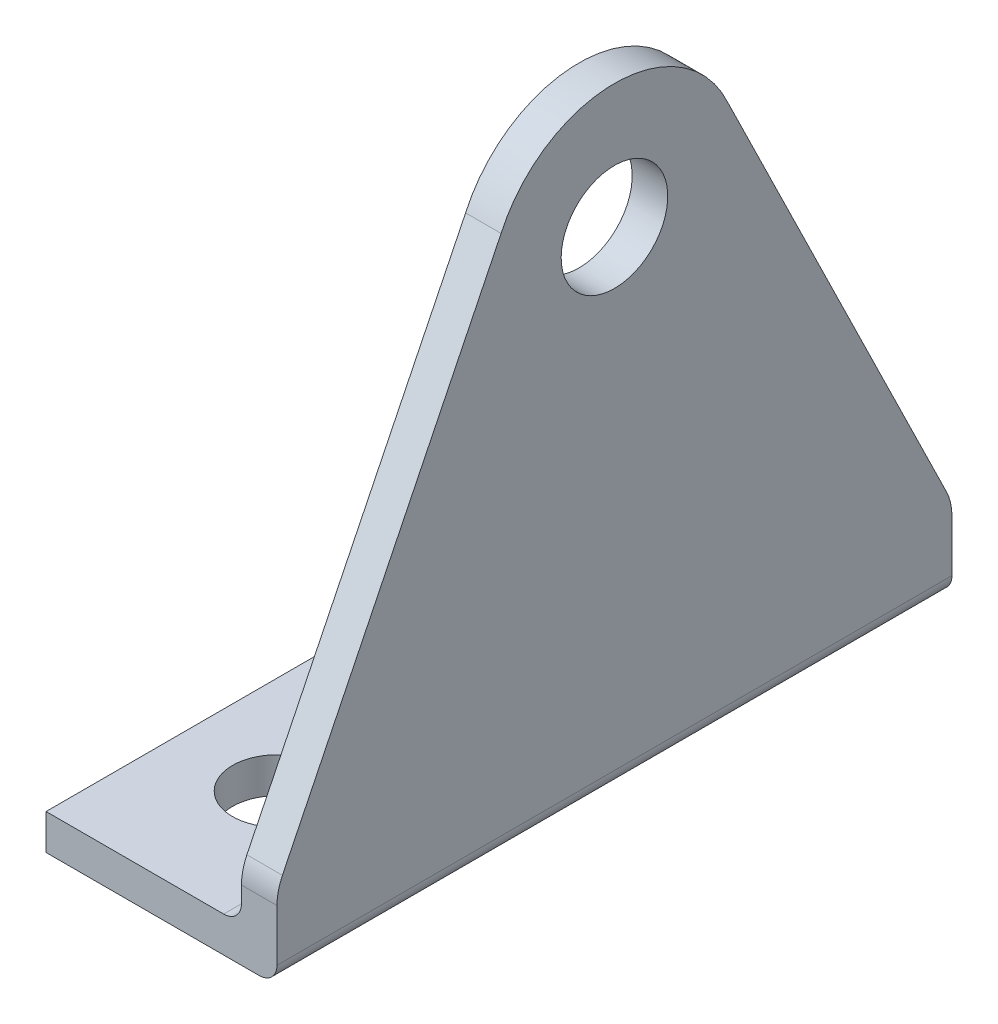
ISO-10303-21;
HEADER;
FILE_DESCRIPTION(('STEP AP214'),'2;1');
FILE_NAME('part.step','',(''),(''),'','','');
FILE_SCHEMA(('AUTOMOTIVE_DESIGN { 1 0 10303 214 1 1 1 1 }'));
ENDSEC;
DATA;
#1=APPLICATION_CONTEXT('core data for automotive mechanical design processes');
#2=APPLICATION_PROTOCOL_DEFINITION('international standard','automotive_design',2000,#1);
#3=PRODUCT_CONTEXT('',#1,'mechanical');
#4=PRODUCT('Part','Part','',(#3));
#5=PRODUCT_RELATED_PRODUCT_CATEGORY('part','',(#4));
#6=PRODUCT_DEFINITION_FORMATION('','',#4);
#7=PRODUCT_DEFINITION_CONTEXT('part definition',#1,'design');
#8=PRODUCT_DEFINITION('design','',#6,#7);
#9=PRODUCT_DEFINITION_SHAPE('','',#8);
#10=(LENGTH_UNIT() NAMED_UNIT(*) SI_UNIT(.MILLI.,.METRE.));
#11=(NAMED_UNIT(*) PLANE_ANGLE_UNIT() SI_UNIT($,.RADIAN.));
#12=(NAMED_UNIT(*) SI_UNIT($,.STERADIAN.) SOLID_ANGLE_UNIT());
#13=UNCERTAINTY_MEASURE_WITH_UNIT(LENGTH_MEASURE(1.E-05),#10,'distance_accuracy_value','');
#14=(GEOMETRIC_REPRESENTATION_CONTEXT(3) GLOBAL_UNCERTAINTY_ASSIGNED_CONTEXT((#13)) GLOBAL_UNIT_ASSIGNED_CONTEXT((#10,
#11,#12)) REPRESENTATION_CONTEXT('',''));
#15=CARTESIAN_POINT('',(0.,0.,0.));
#16=DIRECTION('',(0.,0.,1.));
#17=DIRECTION('',(1.,0.,0.));
#18=AXIS2_PLACEMENT_3D('',#15,#16,#17);
#19=CARTESIAN_POINT('',(-2.,3.00000000000001,38.));
#20=DIRECTION('',(1.,0.,0.));
#21=DIRECTION('',(0.,0.,-1.));
#22=AXIS2_PLACEMENT_3D('',#19,#20,#21);
#23=PLANE('',#22);
#24=CARTESIAN_POINT('',(-2.,27.5,19.));
#25=DIRECTION('',(-1.,0.,0.));
#26=DIRECTION('',(0.,0.,1.));
#27=AXIS2_PLACEMENT_3D('',#24,#25,#26);
#28=CIRCLE('',#27,3.);
#29=CARTESIAN_POINT('',(-2.,27.5,22.));
#30=VERTEX_POINT('',#29);
#31=EDGE_CURVE('E265',#30,#30,#28,.T.);
#32=ORIENTED_EDGE('',*,*,#31,.F.);
#33=EDGE_LOOP('',(#32));
#34=FACE_BOUND('',#33,.T.);
#35=CARTESIAN_POINT('',(-2.,3.91692518941432,35.));
#36=DIRECTION('',(-1.,0.,0.));
#37=DIRECTION('',(0.,0.,1.));
#38=AXIS2_PLACEMENT_3D('',#35,#36,#37);
#39=CIRCLE('',#38,3.);
#40=CARTESIAN_POINT('',(-2.,3.91692518941431,38.));
#41=VERTEX_POINT('',#40);
#42=CARTESIAN_POINT('',(-2.,5.23644561025732,37.6942282492355));
#43=VERTEX_POINT('',#42);
#44=EDGE_CURVE('E341',#41,#43,#39,.T.);
#45=ORIENTED_EDGE('',*,*,#44,.T.);
#46=DIRECTION('',(0.,0.898076083078485,-0.439840140280997));
#47=VECTOR('',#46,1.);
#48=CARTESIAN_POINT('',(-2.,15.9026330808269,32.4703753021252));
#49=LINE('',#48,#47);
#50=CARTESIAN_POINT('',(-2.,30.376686151419,25.3815888919794));
#51=VERTEX_POINT('',#50);
#52=EDGE_CURVE('E277',#43,#51,#49,.T.);
#53=ORIENTED_EDGE('',*,*,#52,.T.);
#54=CARTESIAN_POINT('',(-2.,27.5,19.));
#55=DIRECTION('',(-1.,0.,0.));
#56=DIRECTION('',(0.,0.,1.));
#57=AXIS2_PLACEMENT_3D('',#54,#55,#56);
#58=CIRCLE('',#57,7.);
#59=CARTESIAN_POINT('',(-2.,30.376686151419,12.6184111080206));
#60=VERTEX_POINT('',#59);
#61=EDGE_CURVE('E260',#60,#51,#58,.F.);
#62=ORIENTED_EDGE('',*,*,#61,.F.);
#63=DIRECTION('',(0.,0.898076083078485,0.439840140280997));
#64=VECTOR('',#63,1.);
#65=CARTESIAN_POINT('',(-2.,0.892256486985467,-1.82183056421669));
#66=LINE('',#65,#64);
#67=CARTESIAN_POINT('',(-2.,5.23644561025732,0.305771750764551));
#68=VERTEX_POINT('',#67);
#69=EDGE_CURVE('E268',#68,#60,#66,.T.);
#70=ORIENTED_EDGE('',*,*,#69,.F.);
#71=CARTESIAN_POINT('',(-2.,3.91692518941432,3.));
#72=DIRECTION('',(-1.,0.,0.));
#73=DIRECTION('',(0.,0.,1.));
#74=AXIS2_PLACEMENT_3D('',#71,#72,#73);
#75=CIRCLE('',#74,3.);
#76=CARTESIAN_POINT('',(-2.,3.91692518941431,0.));
#77=VERTEX_POINT('',#76);
#78=EDGE_CURVE('E273',#77,#68,#75,.F.);
#79=ORIENTED_EDGE('',*,*,#78,.F.);
#80=DIRECTION('',(0.,-1.,0.));
#81=VECTOR('',#80,1.);
#82=CARTESIAN_POINT('',(-2.,3.00000000000001,0.));
#83=LINE('',#82,#81);
#84=CARTESIAN_POINT('',(-2.,3.,0.));
#85=VERTEX_POINT('',#84);
#86=EDGE_CURVE('E174',#77,#85,#83,.T.);
#87=ORIENTED_EDGE('',*,*,#86,.T.);
#88=DIRECTION('',(0.,0.,-1.));
#89=VECTOR('',#88,1.);
#90=CARTESIAN_POINT('',(-2.,3.,38.));
#91=LINE('',#90,#89);
#92=CARTESIAN_POINT('',(-2.,3.,38.));
#93=VERTEX_POINT('',#92);
#94=EDGE_CURVE('E12',#93,#85,#91,.T.);
#95=ORIENTED_EDGE('',*,*,#94,.F.);
#96=DIRECTION('',(0.,-1.,0.));
#97=VECTOR('',#96,1.);
#98=CARTESIAN_POINT('',(-2.,3.00000000000001,38.));
#99=LINE('',#98,#97);
#100=EDGE_CURVE('E128',#41,#93,#99,.T.);
#101=ORIENTED_EDGE('',*,*,#100,.F.);
#102=EDGE_LOOP('',(#45,#53,#62,#70,#79,#87,#95,#101));
#103=FACE_BOUND('',#102,.T.);
#104=ADVANCED_FACE('F69',(#34,#103),#23,.F.);
#105=CARTESIAN_POINT('',(0.,1.00000000000001,38.));
#106=DIRECTION('',(-1.,0.,0.));
#107=DIRECTION('',(0.,0.,1.));
#108=AXIS2_PLACEMENT_3D('',#105,#106,#107);
#109=PLANE('',#108);
#110=CARTESIAN_POINT('',(0.,27.5,19.));
#111=DIRECTION('',(-1.,0.,0.));
#112=DIRECTION('',(0.,0.,1.));
#113=AXIS2_PLACEMENT_3D('',#110,#111,#112);
#114=CIRCLE('',#113,3.);
#115=CARTESIAN_POINT('',(0.,27.5,22.));
#116=VERTEX_POINT('',#115);
#117=EDGE_CURVE('E290',#116,#116,#114,.T.);
#118=ORIENTED_EDGE('',*,*,#117,.T.);
#119=EDGE_LOOP('',(#118));
#120=FACE_BOUND('',#119,.T.);
#121=CARTESIAN_POINT('',(0.,3.91692518941432,35.));
#122=DIRECTION('',(-1.,0.,0.));
#123=DIRECTION('',(0.,0.,1.));
#124=AXIS2_PLACEMENT_3D('',#121,#122,#123);
#125=CIRCLE('',#124,3.);
#126=CARTESIAN_POINT('',(0.,3.91692518941431,38.));
#127=VERTEX_POINT('',#126);
#128=CARTESIAN_POINT('',(0.,5.23644561025732,37.6942282492355));
#129=VERTEX_POINT('',#128);
#130=EDGE_CURVE('E221',#127,#129,#125,.T.);
#131=ORIENTED_EDGE('',*,*,#130,.F.);
#132=DIRECTION('',(0.,1.,0.));
#133=VECTOR('',#132,1.);
#134=CARTESIAN_POINT('',(0.,1.00000000000001,38.));
#135=LINE('',#134,#133);
#136=CARTESIAN_POINT('',(0.,1.00000000000001,38.));
#137=VERTEX_POINT('',#136);
#138=EDGE_CURVE('E167',#137,#127,#135,.T.);
#139=ORIENTED_EDGE('',*,*,#138,.F.);
#140=DIRECTION('',(0.,0.,-1.));
#141=VECTOR('',#140,1.);
#142=CARTESIAN_POINT('',(0.,1.00000000000001,38.));
#143=LINE('',#142,#141);
#144=CARTESIAN_POINT('',(0.,1.00000000000001,0.));
#145=VERTEX_POINT('',#144);
#146=EDGE_CURVE('E173',#137,#145,#143,.T.);
#147=ORIENTED_EDGE('',*,*,#146,.T.);
#148=DIRECTION('',(0.,1.,0.));
#149=VECTOR('',#148,1.);
#150=CARTESIAN_POINT('',(0.,1.00000000000001,0.));
#151=LINE('',#150,#149);
#152=CARTESIAN_POINT('',(0.,3.91692518941431,0.));
#153=VERTEX_POINT('',#152);
#154=EDGE_CURVE('E191',#145,#153,#151,.T.);
#155=ORIENTED_EDGE('',*,*,#154,.T.);
#156=CARTESIAN_POINT('',(0.,3.91692518941432,3.));
#157=DIRECTION('',(-1.,0.,0.));
#158=DIRECTION('',(0.,0.,1.));
#159=AXIS2_PLACEMENT_3D('',#156,#157,#158);
#160=CIRCLE('',#159,3.);
#161=CARTESIAN_POINT('',(0.,5.23644561025732,0.305771750764551));
#162=VERTEX_POINT('',#161);
#163=EDGE_CURVE('E84',#153,#162,#160,.F.);
#164=ORIENTED_EDGE('',*,*,#163,.T.);
#165=DIRECTION('',(0.,0.898076083078485,0.439840140280997));
#166=VECTOR('',#165,1.);
#167=CARTESIAN_POINT('',(0.,0.892256486985467,-1.82183056421669));
#168=LINE('',#167,#166);
#169=CARTESIAN_POINT('',(0.,30.376686151419,12.6184111080206));
#170=VERTEX_POINT('',#169);
#171=EDGE_CURVE('E281',#162,#170,#168,.T.);
#172=ORIENTED_EDGE('',*,*,#171,.T.);
#173=CARTESIAN_POINT('',(0.,27.5,19.));
#174=DIRECTION('',(-1.,0.,0.));
#175=DIRECTION('',(0.,0.,1.));
#176=AXIS2_PLACEMENT_3D('',#173,#174,#175);
#177=CIRCLE('',#176,7.);
#178=CARTESIAN_POINT('',(0.,30.376686151419,25.3815888919794));
#179=VERTEX_POINT('',#178);
#180=EDGE_CURVE('E262',#170,#179,#177,.F.);
#181=ORIENTED_EDGE('',*,*,#180,.T.);
#182=DIRECTION('',(0.,0.898076083078485,-0.439840140280997));
#183=VECTOR('',#182,1.);
#184=CARTESIAN_POINT('',(0.,15.9026330808269,32.4703753021252));
#185=LINE('',#184,#183);
#186=EDGE_CURVE('E334',#129,#179,#185,.T.);
#187=ORIENTED_EDGE('',*,*,#186,.F.);
#188=EDGE_LOOP('',(#131,#139,#147,#155,#164,#172,#181,#187));
#189=FACE_BOUND('',#188,.T.);
#190=ADVANCED_FACE('F217',(#120,#189),#109,.F.);
#191=CARTESIAN_POINT('',(-1.,1.,0.));
#192=DIRECTION('',(0.,0.,-1.));
#193=DIRECTION('',(-1.,0.,0.));
#194=AXIS2_PLACEMENT_3D('',#191,#192,#193);
#195=PLANE('',#194);
#196=ORIENTED_EDGE('',*,*,#86,.F.);
#197=DIRECTION('',(-1.,0.,0.));
#198=VECTOR('',#197,1.);
#199=CARTESIAN_POINT('',(0.,3.91692518941431,0.));
#200=LINE('',#199,#198);
#201=EDGE_CURVE('E287',#153,#77,#200,.T.);
#202=ORIENTED_EDGE('',*,*,#201,.F.);
#203=ORIENTED_EDGE('',*,*,#154,.F.);
#204=CARTESIAN_POINT('',(-1.,1.,0.));
#205=DIRECTION('',(0.,0.,1.));
#206=DIRECTION('',(-1.,0.,0.));
#207=AXIS2_PLACEMENT_3D('',#204,#205,#206);
#208=CIRCLE('',#207,1.);
#209=CARTESIAN_POINT('',(-1.00000000000001,0.,0.));
#210=VERTEX_POINT('',#209);
#211=EDGE_CURVE('E120',#210,#145,#208,.T.);
#212=ORIENTED_EDGE('',*,*,#211,.F.);
#213=DIRECTION('',(1.,0.,0.));
#214=VECTOR('',#213,1.);
#215=CARTESIAN_POINT('',(-1.00000000000001,0.,0.));
#216=LINE('',#215,#214);
#217=CARTESIAN_POINT('',(-13.,0.,0.));
#218=VERTEX_POINT('',#217);
#219=EDGE_CURVE('E186',#218,#210,#216,.T.);
#220=ORIENTED_EDGE('',*,*,#219,.F.);
#221=DIRECTION('',(0.,-1.,0.));
#222=VECTOR('',#221,1.);
#223=CARTESIAN_POINT('',(-13.,2.,0.));
#224=LINE('',#223,#222);
#225=CARTESIAN_POINT('',(-13.,2.,0.));
#226=VERTEX_POINT('',#225);
#227=EDGE_CURVE('E156',#226,#218,#224,.T.);
#228=ORIENTED_EDGE('',*,*,#227,.F.);
#229=DIRECTION('',(-1.,0.,0.));
#230=VECTOR('',#229,1.);
#231=CARTESIAN_POINT('',(-3.00000000000001,2.,0.));
#232=LINE('',#231,#230);
#233=CARTESIAN_POINT('',(-3.00000000000001,2.,0.));
#234=VERTEX_POINT('',#233);
#235=EDGE_CURVE('E181',#234,#226,#232,.T.);
#236=ORIENTED_EDGE('',*,*,#235,.F.);
#237=CARTESIAN_POINT('',(-3.,3.,0.));
#238=DIRECTION('',(0.,0.,-1.));
#239=DIRECTION('',(1.,0.,0.));
#240=AXIS2_PLACEMENT_3D('',#237,#238,#239);
#241=CIRCLE('',#240,1.);
#242=EDGE_CURVE('E177',#85,#234,#241,.T.);
#243=ORIENTED_EDGE('',*,*,#242,.F.);
#244=EDGE_LOOP('',(#196,#202,#203,#212,#220,#228,#236,#243));
#245=FACE_BOUND('',#244,.T.);
#246=ADVANCED_FACE('F211',(#245),#195,.T.);
#247=CARTESIAN_POINT('',(-3.,3.,38.));
#248=DIRECTION('',(0.,0.,-1.));
#249=DIRECTION('',(-1.,0.,0.));
#250=AXIS2_PLACEMENT_3D('',#247,#248,#249);
#251=CYLINDRICAL_SURFACE('',#250,1.);
#252=ORIENTED_EDGE('',*,*,#242,.T.);
#253=DIRECTION('',(0.,0.,-1.));
#254=VECTOR('',#253,1.);
#255=CARTESIAN_POINT('',(-3.00000000000001,2.,38.));
#256=LINE('',#255,#254);
#257=CARTESIAN_POINT('',(-3.00000000000001,2.,38.));
#258=VERTEX_POINT('',#257);
#259=EDGE_CURVE('E77',#258,#234,#256,.T.);
#260=ORIENTED_EDGE('',*,*,#259,.F.);
#261=CARTESIAN_POINT('',(-3.,3.,38.));
#262=DIRECTION('',(0.,0.,-1.));
#263=DIRECTION('',(1.,0.,0.));
#264=AXIS2_PLACEMENT_3D('',#261,#262,#263);
#265=CIRCLE('',#264,1.);
#266=EDGE_CURVE('E314',#93,#258,#265,.T.);
#267=ORIENTED_EDGE('',*,*,#266,.F.);
#268=ORIENTED_EDGE('',*,*,#94,.T.);
#269=EDGE_LOOP('',(#252,#260,#267,#268));
#270=FACE_BOUND('',#269,.T.);
#271=ADVANCED_FACE('F386',(#270),#251,.F.);
#272=CARTESIAN_POINT('',(-3.00000000000001,2.,38.));
#273=DIRECTION('',(0.,-1.,0.));
#274=DIRECTION('',(0.,0.,-1.));
#275=AXIS2_PLACEMENT_3D('',#272,#273,#274);
#276=PLANE('',#275);
#277=CARTESIAN_POINT('',(-7.5,2.,7.5));
#278=DIRECTION('',(0.,1.,0.));
#279=DIRECTION('',(0.,0.,1.));
#280=AXIS2_PLACEMENT_3D('',#277,#278,#279);
#281=CIRCLE('',#280,2.5);
#282=CARTESIAN_POINT('',(-7.5,2.,10.));
#283=VERTEX_POINT('',#282);
#284=EDGE_CURVE('E301',#283,#283,#281,.T.);
#285=ORIENTED_EDGE('',*,*,#284,.F.);
#286=EDGE_LOOP('',(#285));
#287=FACE_BOUND('',#286,.T.);
#288=CARTESIAN_POINT('',(-7.5,2.,30.5));
#289=DIRECTION('',(0.,1.,0.));
#290=DIRECTION('',(0.,0.,-1.));
#291=AXIS2_PLACEMENT_3D('',#288,#289,#290);
#292=CIRCLE('',#291,2.5);
#293=CARTESIAN_POINT('',(-7.5,2.,28.));
#294=VERTEX_POINT('',#293);
#295=EDGE_CURVE('E294',#294,#294,#292,.T.);
#296=ORIENTED_EDGE('',*,*,#295,.F.);
#297=EDGE_LOOP('',(#296));
#298=FACE_BOUND('',#297,.T.);
#299=ORIENTED_EDGE('',*,*,#235,.T.);
#300=DIRECTION('',(0.,0.,-1.));
#301=VECTOR('',#300,1.);
#302=CARTESIAN_POINT('',(-13.,2.,38.));
#303=LINE('',#302,#301);
#304=CARTESIAN_POINT('',(-13.,2.,38.));
#305=VERTEX_POINT('',#304);
#306=EDGE_CURVE('E160',#305,#226,#303,.T.);
#307=ORIENTED_EDGE('',*,*,#306,.F.);
#308=DIRECTION('',(-1.,0.,0.));
#309=VECTOR('',#308,1.);
#310=CARTESIAN_POINT('',(-3.00000000000001,2.,38.));
#311=LINE('',#310,#309);
#312=EDGE_CURVE('E146',#258,#305,#311,.T.);
#313=ORIENTED_EDGE('',*,*,#312,.F.);
#314=ORIENTED_EDGE('',*,*,#259,.T.);
#315=EDGE_LOOP('',(#299,#307,#313,#314));
#316=FACE_BOUND('',#315,.T.);
#317=ADVANCED_FACE('F205',(#287,#298,#316),#276,.F.);
#318=CARTESIAN_POINT('',(-13.,2.,38.));
#319=DIRECTION('',(1.,0.,0.));
#320=DIRECTION('',(0.,0.,-1.));
#321=AXIS2_PLACEMENT_3D('',#318,#319,#320);
#322=PLANE('',#321);
#323=ORIENTED_EDGE('',*,*,#227,.T.);
#324=DIRECTION('',(0.,0.,-1.));
#325=VECTOR('',#324,1.);
#326=CARTESIAN_POINT('',(-13.,0.,38.));
#327=LINE('',#326,#325);
#328=CARTESIAN_POINT('',(-13.,0.,38.));
#329=VERTEX_POINT('',#328);
#330=EDGE_CURVE('E153',#329,#218,#327,.T.);
#331=ORIENTED_EDGE('',*,*,#330,.F.);
#332=DIRECTION('',(0.,-1.,0.));
#333=VECTOR('',#332,1.);
#334=CARTESIAN_POINT('',(-13.,2.,38.));
#335=LINE('',#334,#333);
#336=EDGE_CURVE('E139',#305,#329,#335,.T.);
#337=ORIENTED_EDGE('',*,*,#336,.F.);
#338=ORIENTED_EDGE('',*,*,#306,.T.);
#339=EDGE_LOOP('',(#323,#331,#337,#338));
#340=FACE_BOUND('',#339,.T.);
#341=ADVANCED_FACE('F154',(#340),#322,.F.);
#342=CARTESIAN_POINT('',(-1.00000000000001,0.,38.));
#343=DIRECTION('',(0.,1.,0.));
#344=DIRECTION('',(-1.,0.,0.));
#345=AXIS2_PLACEMENT_3D('',#342,#343,#344);
#346=PLANE('',#345);
#347=CARTESIAN_POINT('',(-7.5,0.,7.5));
#348=DIRECTION('',(0.,1.,0.));
#349=DIRECTION('',(0.,0.,1.));
#350=AXIS2_PLACEMENT_3D('',#347,#348,#349);
#351=CIRCLE('',#350,2.5);
#352=CARTESIAN_POINT('',(-7.5,0.,10.));
#353=VERTEX_POINT('',#352);
#354=EDGE_CURVE('E178',#353,#353,#351,.T.);
#355=ORIENTED_EDGE('',*,*,#354,.T.);
#356=EDGE_LOOP('',(#355));
#357=FACE_BOUND('',#356,.T.);
#358=CARTESIAN_POINT('',(-7.5,0.,30.5));
#359=DIRECTION('',(0.,1.,0.));
#360=DIRECTION('',(0.,0.,-1.));
#361=AXIS2_PLACEMENT_3D('',#358,#359,#360);
#362=CIRCLE('',#361,2.5);
#363=CARTESIAN_POINT('',(-7.5,0.,28.));
#364=VERTEX_POINT('',#363);
#365=EDGE_CURVE('E305',#364,#364,#362,.T.);
#366=ORIENTED_EDGE('',*,*,#365,.T.);
#367=EDGE_LOOP('',(#366));
#368=FACE_BOUND('',#367,.T.);
#369=ORIENTED_EDGE('',*,*,#219,.T.);
#370=DIRECTION('',(0.,0.,-1.));
#371=VECTOR('',#370,1.);
#372=CARTESIAN_POINT('',(-1.00000000000001,0.,38.));
#373=LINE('',#372,#371);
#374=CARTESIAN_POINT('',(-1.00000000000001,0.,38.));
#375=VERTEX_POINT('',#374);
#376=EDGE_CURVE('E161',#375,#210,#373,.T.);
#377=ORIENTED_EDGE('',*,*,#376,.F.);
#378=DIRECTION('',(1.,0.,0.));
#379=VECTOR('',#378,1.);
#380=CARTESIAN_POINT('',(-1.00000000000001,0.,38.));
#381=LINE('',#380,#379);
#382=EDGE_CURVE('E143',#329,#375,#381,.T.);
#383=ORIENTED_EDGE('',*,*,#382,.F.);
#384=ORIENTED_EDGE('',*,*,#330,.T.);
#385=EDGE_LOOP('',(#369,#377,#383,#384));
#386=FACE_BOUND('',#385,.T.);
#387=ADVANCED_FACE('F163',(#357,#368,#386),#346,.F.);
#388=CARTESIAN_POINT('',(-1.,1.,38.));
#389=DIRECTION('',(0.,0.,-1.));
#390=DIRECTION('',(-1.,0.,0.));
#391=AXIS2_PLACEMENT_3D('',#388,#389,#390);
#392=CYLINDRICAL_SURFACE('',#391,1.);
#393=ORIENTED_EDGE('',*,*,#211,.T.);
#394=ORIENTED_EDGE('',*,*,#146,.F.);
#395=CARTESIAN_POINT('',(-1.,1.,38.));
#396=DIRECTION('',(0.,0.,1.));
#397=DIRECTION('',(-1.,0.,0.));
#398=AXIS2_PLACEMENT_3D('',#395,#396,#397);
#399=CIRCLE('',#398,1.);
#400=EDGE_CURVE('E93',#375,#137,#399,.T.);
#401=ORIENTED_EDGE('',*,*,#400,.F.);
#402=ORIENTED_EDGE('',*,*,#376,.T.);
#403=EDGE_LOOP('',(#393,#394,#401,#402));
#404=FACE_BOUND('',#403,.T.);
#405=ADVANCED_FACE('F213',(#404),#392,.T.);
#406=CARTESIAN_POINT('',(-1.,1.,38.));
#407=DIRECTION('',(0.,0.,-1.));
#408=DIRECTION('',(-1.,0.,0.));
#409=AXIS2_PLACEMENT_3D('',#406,#407,#408);
#410=PLANE('',#409);
#411=ORIENTED_EDGE('',*,*,#138,.T.);
#412=DIRECTION('',(-1.,0.,0.));
#413=VECTOR('',#412,1.);
#414=CARTESIAN_POINT('',(0.,3.91692518941431,38.));
#415=LINE('',#414,#413);
#416=EDGE_CURVE('E224',#127,#41,#415,.T.);
#417=ORIENTED_EDGE('',*,*,#416,.T.);
#418=ORIENTED_EDGE('',*,*,#100,.T.);
#419=ORIENTED_EDGE('',*,*,#266,.T.);
#420=ORIENTED_EDGE('',*,*,#312,.T.);
#421=ORIENTED_EDGE('',*,*,#336,.T.);
#422=ORIENTED_EDGE('',*,*,#382,.T.);
#423=ORIENTED_EDGE('',*,*,#400,.T.);
#424=EDGE_LOOP('',(#411,#417,#418,#419,#420,#421,#422,#423));
#425=FACE_BOUND('',#424,.T.);
#426=ADVANCED_FACE('F141',(#425),#410,.F.);
#427=CARTESIAN_POINT('',(-7.5,0.,30.5));
#428=DIRECTION('',(0.,1.,0.));
#429=DIRECTION('',(0.,0.,1.));
#430=AXIS2_PLACEMENT_3D('',#427,#428,#429);
#431=CYLINDRICAL_SURFACE('',#430,2.5);
#432=ORIENTED_EDGE('',*,*,#365,.F.);
#433=EDGE_LOOP('',(#432));
#434=FACE_BOUND('',#433,.T.);
#435=ORIENTED_EDGE('',*,*,#295,.T.);
#436=EDGE_LOOP('',(#435));
#437=FACE_BOUND('',#436,.T.);
#438=ADVANCED_FACE('F374',(#434,#437),#431,.F.);
#439=CARTESIAN_POINT('',(-7.5,0.,7.5));
#440=DIRECTION('',(0.,1.,0.));
#441=DIRECTION('',(0.,0.,1.));
#442=AXIS2_PLACEMENT_3D('',#439,#440,#441);
#443=CYLINDRICAL_SURFACE('',#442,2.5);
#444=ORIENTED_EDGE('',*,*,#354,.F.);
#445=EDGE_LOOP('',(#444));
#446=FACE_BOUND('',#445,.T.);
#447=ORIENTED_EDGE('',*,*,#284,.T.);
#448=EDGE_LOOP('',(#447));
#449=FACE_BOUND('',#448,.T.);
#450=ADVANCED_FACE('F367',(#446,#449),#443,.F.);
#451=CARTESIAN_POINT('',(0.,27.5,19.));
#452=DIRECTION('',(-1.,0.,0.));
#453=DIRECTION('',(0.,0.,1.));
#454=AXIS2_PLACEMENT_3D('',#451,#452,#453);
#455=CYLINDRICAL_SURFACE('',#454,3.);
#456=ORIENTED_EDGE('',*,*,#117,.F.);
#457=EDGE_LOOP('',(#456));
#458=FACE_BOUND('',#457,.T.);
#459=ORIENTED_EDGE('',*,*,#31,.T.);
#460=EDGE_LOOP('',(#459));
#461=FACE_BOUND('',#460,.T.);
#462=ADVANCED_FACE('F365',(#458,#461),#455,.F.);
#463=CARTESIAN_POINT('',(0.,27.5,19.));
#464=DIRECTION('',(-1.,0.,0.));
#465=DIRECTION('',(0.,0.,1.));
#466=AXIS2_PLACEMENT_3D('',#463,#464,#465);
#467=CYLINDRICAL_SURFACE('',#466,7.);
#468=ORIENTED_EDGE('',*,*,#61,.T.);
#469=DIRECTION('',(-1.,0.,0.));
#470=VECTOR('',#469,1.);
#471=CARTESIAN_POINT('',(0.,30.376686151419,25.3815888919794));
#472=LINE('',#471,#470);
#473=EDGE_CURVE('E326',#179,#51,#472,.T.);
#474=ORIENTED_EDGE('',*,*,#473,.F.);
#475=ORIENTED_EDGE('',*,*,#180,.F.);
#476=DIRECTION('',(-1.,0.,0.));
#477=VECTOR('',#476,1.);
#478=CARTESIAN_POINT('',(0.,30.376686151419,12.6184111080206));
#479=LINE('',#478,#477);
#480=EDGE_CURVE('E256',#170,#60,#479,.T.);
#481=ORIENTED_EDGE('',*,*,#480,.T.);
#482=EDGE_LOOP('',(#468,#474,#475,#481));
#483=FACE_BOUND('',#482,.T.);
#484=ADVANCED_FACE('F257',(#483),#467,.T.);
#485=CARTESIAN_POINT('',(0.,0.892256486985467,-1.82183056421669));
#486=DIRECTION('',(0.,-0.439840140280997,0.898076083078485));
#487=DIRECTION('',(0.,-0.898076083078485,-0.439840140280997));
#488=AXIS2_PLACEMENT_3D('',#485,#486,#487);
#489=PLANE('',#488);
#490=ORIENTED_EDGE('',*,*,#69,.T.);
#491=ORIENTED_EDGE('',*,*,#480,.F.);
#492=ORIENTED_EDGE('',*,*,#171,.F.);
#493=DIRECTION('',(-1.,0.,0.));
#494=VECTOR('',#493,1.);
#495=CARTESIAN_POINT('',(0.,5.23644561025732,0.305771750764551));
#496=LINE('',#495,#494);
#497=EDGE_CURVE('E251',#162,#68,#496,.T.);
#498=ORIENTED_EDGE('',*,*,#497,.T.);
#499=EDGE_LOOP('',(#490,#491,#492,#498));
#500=FACE_BOUND('',#499,.T.);
#501=ADVANCED_FACE('F269',(#500),#489,.F.);
#502=CARTESIAN_POINT('',(0.,3.91692518941432,3.));
#503=DIRECTION('',(-1.,0.,0.));
#504=DIRECTION('',(0.,0.,1.));
#505=AXIS2_PLACEMENT_3D('',#502,#503,#504);
#506=CYLINDRICAL_SURFACE('',#505,3.);
#507=ORIENTED_EDGE('',*,*,#78,.T.);
#508=ORIENTED_EDGE('',*,*,#497,.F.);
#509=ORIENTED_EDGE('',*,*,#163,.F.);
#510=ORIENTED_EDGE('',*,*,#201,.T.);
#511=EDGE_LOOP('',(#507,#508,#509,#510));
#512=FACE_BOUND('',#511,.T.);
#513=ADVANCED_FACE('F347',(#512),#506,.T.);
#514=CARTESIAN_POINT('',(0.,3.91692518941432,35.));
#515=DIRECTION('',(-1.,0.,0.));
#516=DIRECTION('',(0.,0.,1.));
#517=AXIS2_PLACEMENT_3D('',#514,#515,#516);
#518=CYLINDRICAL_SURFACE('',#517,3.);
#519=ORIENTED_EDGE('',*,*,#44,.F.);
#520=ORIENTED_EDGE('',*,*,#416,.F.);
#521=ORIENTED_EDGE('',*,*,#130,.T.);
#522=DIRECTION('',(-1.,0.,0.));
#523=VECTOR('',#522,1.);
#524=CARTESIAN_POINT('',(0.,5.23644561025732,37.6942282492355));
#525=LINE('',#524,#523);
#526=EDGE_CURVE('E323',#129,#43,#525,.T.);
#527=ORIENTED_EDGE('',*,*,#526,.T.);
#528=EDGE_LOOP('',(#519,#520,#521,#527));
#529=FACE_BOUND('',#528,.T.);
#530=ADVANCED_FACE('F344',(#529),#518,.T.);
#531=CARTESIAN_POINT('',(0.,15.9026330808269,32.4703753021252));
#532=DIRECTION('',(0.,0.439840140280997,0.898076083078485));
#533=DIRECTION('',(0.,-0.898076083078485,0.439840140280997));
#534=AXIS2_PLACEMENT_3D('',#531,#532,#533);
#535=PLANE('',#534);
#536=ORIENTED_EDGE('',*,*,#52,.F.);
#537=ORIENTED_EDGE('',*,*,#526,.F.);
#538=ORIENTED_EDGE('',*,*,#186,.T.);
#539=ORIENTED_EDGE('',*,*,#473,.T.);
#540=EDGE_LOOP('',(#536,#537,#538,#539));
#541=FACE_BOUND('',#540,.T.);
#542=ADVANCED_FACE('F346',(#541),#535,.T.);
#543=CLOSED_SHELL('',(#104,#190,#246,#271,#317,#341,#387,#405,#426,#438,#450,#462,#484,#501,
#513,#530,#542));
#544=MANIFOLD_SOLID_BREP('B2',#543);
#545=ADVANCED_BREP_SHAPE_REPRESENTATION('',(#18,#544),#14);
#546=SHAPE_DEFINITION_REPRESENTATION(#9,#545);
ENDSEC;
END-ISO-10303-21;
